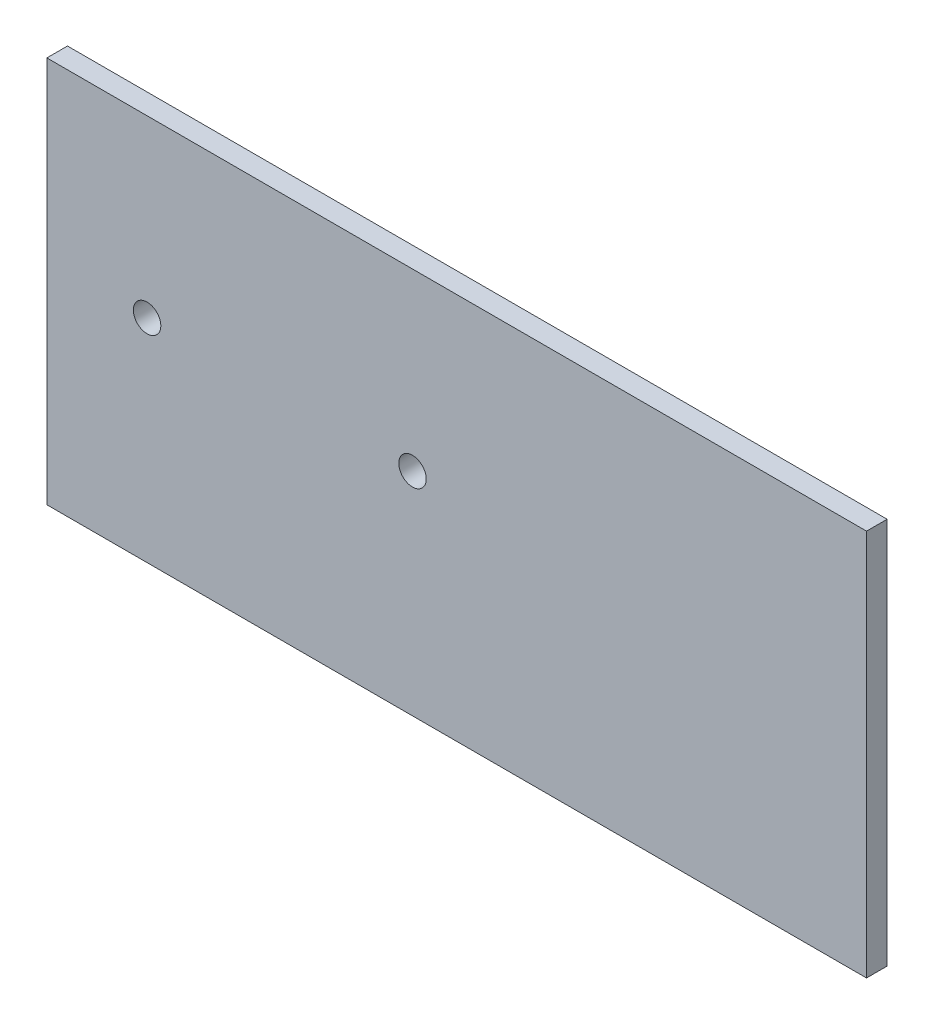
ISO-10303-21;
HEADER;
FILE_DESCRIPTION(('STEP AP214'),'2;1');
FILE_NAME('part.step','',(''),(''),'','','');
FILE_SCHEMA(('AUTOMOTIVE_DESIGN { 1 0 10303 214 1 1 1 1 }'));
ENDSEC;
DATA;
#1=APPLICATION_CONTEXT('core data for automotive mechanical design processes');
#2=APPLICATION_PROTOCOL_DEFINITION('international standard','automotive_design',2000,#1);
#3=PRODUCT_CONTEXT('',#1,'mechanical');
#4=PRODUCT('Part','Part','',(#3));
#5=PRODUCT_RELATED_PRODUCT_CATEGORY('part','',(#4));
#6=PRODUCT_DEFINITION_FORMATION('','',#4);
#7=PRODUCT_DEFINITION_CONTEXT('part definition',#1,'design');
#8=PRODUCT_DEFINITION('design','',#6,#7);
#9=PRODUCT_DEFINITION_SHAPE('','',#8);
#10=(LENGTH_UNIT() NAMED_UNIT(*) SI_UNIT(.MILLI.,.METRE.));
#11=(NAMED_UNIT(*) PLANE_ANGLE_UNIT() SI_UNIT($,.RADIAN.));
#12=(NAMED_UNIT(*) SI_UNIT($,.STERADIAN.) SOLID_ANGLE_UNIT());
#13=UNCERTAINTY_MEASURE_WITH_UNIT(LENGTH_MEASURE(1.E-05),#10,'distance_accuracy_value','');
#14=(GEOMETRIC_REPRESENTATION_CONTEXT(3) GLOBAL_UNCERTAINTY_ASSIGNED_CONTEXT((#13)) GLOBAL_UNIT_ASSIGNED_CONTEXT((#10,
#11,#12)) REPRESENTATION_CONTEXT('',''));
#15=CARTESIAN_POINT('',(0.,0.,0.));
#16=DIRECTION('',(0.,0.,1.));
#17=DIRECTION('',(1.,0.,0.));
#18=AXIS2_PLACEMENT_3D('',#15,#16,#17);
#19=CARTESIAN_POINT('',(0.,0.,3.));
#20=DIRECTION('',(0.,0.,1.));
#21=DIRECTION('',(1.,0.,0.));
#22=AXIS2_PLACEMENT_3D('',#19,#20,#21);
#23=PLANE('',#22);
#24=CARTESIAN_POINT('',(-29.1237716692326,0.,3.));
#25=DIRECTION('',(0.,0.,1.));
#26=DIRECTION('',(1.,0.,0.));
#27=AXIS2_PLACEMENT_3D('',#24,#25,#26);
#28=CIRCLE('',#27,2.);
#29=CARTESIAN_POINT('',(-27.1237716692326,0.,3.));
#30=VERTEX_POINT('',#29);
#31=EDGE_CURVE('E129',#30,#30,#28,.T.);
#32=ORIENTED_EDGE('',*,*,#31,.F.);
#33=EDGE_LOOP('',(#32));
#34=FACE_BOUND('',#33,.T.);
#35=DIRECTION('',(0.,-1.,0.));
#36=VECTOR('',#35,1.);
#37=CARTESIAN_POINT('',(-82.3508635107341,25.4889113146295,3.));
#38=LINE('',#37,#36);
#39=CARTESIAN_POINT('',(-82.3508635107341,25.4889113146295,3.));
#40=VERTEX_POINT('',#39);
#41=CARTESIAN_POINT('',(-82.3508635107341,-30.8533450766115,3.));
#42=VERTEX_POINT('',#41);
#43=EDGE_CURVE('E113',#40,#42,#38,.T.);
#44=ORIENTED_EDGE('',*,*,#43,.T.);
#45=DIRECTION('',(1.,0.,0.));
#46=VECTOR('',#45,1.);
#47=CARTESIAN_POINT('',(-82.3508635107341,-30.8533450766115,3.));
#48=LINE('',#47,#46);
#49=CARTESIAN_POINT('',(36.9766227327241,-30.8533450766115,3.));
#50=VERTEX_POINT('',#49);
#51=EDGE_CURVE('E105',#42,#50,#48,.T.);
#52=ORIENTED_EDGE('',*,*,#51,.T.);
#53=DIRECTION('',(0.,-1.,0.));
#54=VECTOR('',#53,1.);
#55=CARTESIAN_POINT('',(36.9766227327241,25.4889113146295,3.));
#56=LINE('',#55,#54);
#57=CARTESIAN_POINT('',(36.9766227327241,25.4889113146295,3.));
#58=VERTEX_POINT('',#57);
#59=EDGE_CURVE('E112',#58,#50,#56,.T.);
#60=ORIENTED_EDGE('',*,*,#59,.F.);
#61=DIRECTION('',(1.,0.,0.));
#62=VECTOR('',#61,1.);
#63=CARTESIAN_POINT('',(-82.3508635107341,25.4889113146295,3.));
#64=LINE('',#63,#62);
#65=EDGE_CURVE('E122',#40,#58,#64,.T.);
#66=ORIENTED_EDGE('',*,*,#65,.F.);
#67=EDGE_LOOP('',(#44,#52,#60,#66));
#68=FACE_BOUND('',#67,.T.);
#69=CARTESIAN_POINT('',(-67.7615716692326,0.,3.));
#70=DIRECTION('',(0.,0.,1.));
#71=DIRECTION('',(1.,0.,0.));
#72=AXIS2_PLACEMENT_3D('',#69,#70,#71);
#73=CIRCLE('',#72,2.);
#74=CARTESIAN_POINT('',(-65.7615716692326,0.,3.));
#75=VERTEX_POINT('',#74);
#76=EDGE_CURVE('E142',#75,#75,#73,.T.);
#77=ORIENTED_EDGE('',*,*,#76,.F.);
#78=EDGE_LOOP('',(#77));
#79=FACE_BOUND('',#78,.T.);
#80=ADVANCED_FACE('F63',(#34,#68,#79),#23,.T.);
#81=CARTESIAN_POINT('',(0.,0.,0.));
#82=DIRECTION('',(0.,0.,1.));
#83=DIRECTION('',(1.,0.,0.));
#84=AXIS2_PLACEMENT_3D('',#81,#82,#83);
#85=PLANE('',#84);
#86=CARTESIAN_POINT('',(-29.1237716692326,0.,0.));
#87=DIRECTION('',(0.,0.,1.));
#88=DIRECTION('',(1.,0.,0.));
#89=AXIS2_PLACEMENT_3D('',#86,#87,#88);
#90=CIRCLE('',#89,2.);
#91=CARTESIAN_POINT('',(-27.1237716692326,0.,0.));
#92=VERTEX_POINT('',#91);
#93=EDGE_CURVE('E139',#92,#92,#90,.T.);
#94=ORIENTED_EDGE('',*,*,#93,.T.);
#95=EDGE_LOOP('',(#94));
#96=FACE_BOUND('',#95,.T.);
#97=DIRECTION('',(0.,-1.,0.));
#98=VECTOR('',#97,1.);
#99=CARTESIAN_POINT('',(-82.3508635107341,25.4889113146295,0.));
#100=LINE('',#99,#98);
#101=CARTESIAN_POINT('',(-82.3508635107341,25.4889113146295,0.));
#102=VERTEX_POINT('',#101);
#103=CARTESIAN_POINT('',(-82.3508635107341,-30.8533450766115,0.));
#104=VERTEX_POINT('',#103);
#105=EDGE_CURVE('E127',#102,#104,#100,.T.);
#106=ORIENTED_EDGE('',*,*,#105,.F.);
#107=DIRECTION('',(1.,0.,0.));
#108=VECTOR('',#107,1.);
#109=CARTESIAN_POINT('',(-82.3508635107341,25.4889113146295,0.));
#110=LINE('',#109,#108);
#111=CARTESIAN_POINT('',(36.9766227327241,25.4889113146295,0.));
#112=VERTEX_POINT('',#111);
#113=EDGE_CURVE('E133',#102,#112,#110,.T.);
#114=ORIENTED_EDGE('',*,*,#113,.T.);
#115=DIRECTION('',(0.,-1.,0.));
#116=VECTOR('',#115,1.);
#117=CARTESIAN_POINT('',(36.9766227327241,25.4889113146295,0.));
#118=LINE('',#117,#116);
#119=CARTESIAN_POINT('',(36.9766227327241,-30.8533450766115,0.));
#120=VERTEX_POINT('',#119);
#121=EDGE_CURVE('E131',#112,#120,#118,.T.);
#122=ORIENTED_EDGE('',*,*,#121,.T.);
#123=DIRECTION('',(1.,0.,0.));
#124=VECTOR('',#123,1.);
#125=CARTESIAN_POINT('',(-82.3508635107341,-30.8533450766115,0.));
#126=LINE('',#125,#124);
#127=EDGE_CURVE('E118',#104,#120,#126,.T.);
#128=ORIENTED_EDGE('',*,*,#127,.F.);
#129=EDGE_LOOP('',(#106,#114,#122,#128));
#130=FACE_BOUND('',#129,.T.);
#131=CARTESIAN_POINT('',(-67.7615716692326,0.,0.));
#132=DIRECTION('',(0.,0.,1.));
#133=DIRECTION('',(1.,0.,0.));
#134=AXIS2_PLACEMENT_3D('',#131,#132,#133);
#135=CIRCLE('',#134,2.);
#136=CARTESIAN_POINT('',(-65.7615716692326,0.,0.));
#137=VERTEX_POINT('',#136);
#138=EDGE_CURVE('E145',#137,#137,#135,.T.);
#139=ORIENTED_EDGE('',*,*,#138,.T.);
#140=EDGE_LOOP('',(#139));
#141=FACE_BOUND('',#140,.T.);
#142=ADVANCED_FACE('F154',(#96,#130,#141),#85,.F.);
#143=CARTESIAN_POINT('',(-82.3508635107341,25.4889113146295,3.));
#144=DIRECTION('',(1.,0.,0.));
#145=DIRECTION('',(0.,0.,-1.));
#146=AXIS2_PLACEMENT_3D('',#143,#144,#145);
#147=PLANE('',#146);
#148=ORIENTED_EDGE('',*,*,#105,.T.);
#149=DIRECTION('',(0.,0.,-1.));
#150=VECTOR('',#149,1.);
#151=CARTESIAN_POINT('',(-82.3508635107341,-30.8533450766115,3.));
#152=LINE('',#151,#150);
#153=EDGE_CURVE('E12',#42,#104,#152,.T.);
#154=ORIENTED_EDGE('',*,*,#153,.F.);
#155=ORIENTED_EDGE('',*,*,#43,.F.);
#156=DIRECTION('',(0.,0.,-1.));
#157=VECTOR('',#156,1.);
#158=CARTESIAN_POINT('',(-82.3508635107341,25.4889113146295,3.));
#159=LINE('',#158,#157);
#160=EDGE_CURVE('E80',#40,#102,#159,.T.);
#161=ORIENTED_EDGE('',*,*,#160,.T.);
#162=EDGE_LOOP('',(#148,#154,#155,#161));
#163=FACE_BOUND('',#162,.T.);
#164=ADVANCED_FACE('F65',(#163),#147,.F.);
#165=CARTESIAN_POINT('',(-82.3508635107341,-30.8533450766115,3.));
#166=DIRECTION('',(0.,1.,0.));
#167=DIRECTION('',(0.,0.,1.));
#168=AXIS2_PLACEMENT_3D('',#165,#166,#167);
#169=PLANE('',#168);
#170=ORIENTED_EDGE('',*,*,#127,.T.);
#171=DIRECTION('',(0.,0.,-1.));
#172=VECTOR('',#171,1.);
#173=CARTESIAN_POINT('',(36.9766227327241,-30.8533450766115,3.));
#174=LINE('',#173,#172);
#175=EDGE_CURVE('E72',#50,#120,#174,.T.);
#176=ORIENTED_EDGE('',*,*,#175,.F.);
#177=ORIENTED_EDGE('',*,*,#51,.F.);
#178=ORIENTED_EDGE('',*,*,#153,.T.);
#179=EDGE_LOOP('',(#170,#176,#177,#178));
#180=FACE_BOUND('',#179,.T.);
#181=ADVANCED_FACE('F117',(#180),#169,.F.);
#182=CARTESIAN_POINT('',(36.9766227327241,25.4889113146295,3.));
#183=DIRECTION('',(1.,0.,0.));
#184=DIRECTION('',(0.,0.,-1.));
#185=AXIS2_PLACEMENT_3D('',#182,#183,#184);
#186=PLANE('',#185);
#187=ORIENTED_EDGE('',*,*,#121,.F.);
#188=DIRECTION('',(0.,0.,-1.));
#189=VECTOR('',#188,1.);
#190=CARTESIAN_POINT('',(36.9766227327241,25.4889113146295,3.));
#191=LINE('',#190,#189);
#192=EDGE_CURVE('E94',#58,#112,#191,.T.);
#193=ORIENTED_EDGE('',*,*,#192,.F.);
#194=ORIENTED_EDGE('',*,*,#59,.T.);
#195=ORIENTED_EDGE('',*,*,#175,.T.);
#196=EDGE_LOOP('',(#187,#193,#194,#195));
#197=FACE_BOUND('',#196,.T.);
#198=ADVANCED_FACE('F121',(#197),#186,.T.);
#199=CARTESIAN_POINT('',(-82.3508635107341,25.4889113146295,3.));
#200=DIRECTION('',(0.,1.,0.));
#201=DIRECTION('',(0.,0.,1.));
#202=AXIS2_PLACEMENT_3D('',#199,#200,#201);
#203=PLANE('',#202);
#204=ORIENTED_EDGE('',*,*,#113,.F.);
#205=ORIENTED_EDGE('',*,*,#160,.F.);
#206=ORIENTED_EDGE('',*,*,#65,.T.);
#207=ORIENTED_EDGE('',*,*,#192,.T.);
#208=EDGE_LOOP('',(#204,#205,#206,#207));
#209=FACE_BOUND('',#208,.T.);
#210=ADVANCED_FACE('F167',(#209),#203,.T.);
#211=CARTESIAN_POINT('',(-29.1237716692326,0.,3.));
#212=DIRECTION('',(0.,0.,-1.));
#213=DIRECTION('',(-1.,0.,0.));
#214=AXIS2_PLACEMENT_3D('',#211,#212,#213);
#215=CYLINDRICAL_SURFACE('',#214,2.);
#216=ORIENTED_EDGE('',*,*,#31,.T.);
#217=EDGE_LOOP('',(#216));
#218=FACE_BOUND('',#217,.T.);
#219=ORIENTED_EDGE('',*,*,#93,.F.);
#220=EDGE_LOOP('',(#219));
#221=FACE_BOUND('',#220,.T.);
#222=ADVANCED_FACE('F164',(#218,#221),#215,.F.);
#223=CARTESIAN_POINT('',(-67.7615716692326,0.,3.));
#224=DIRECTION('',(0.,0.,-1.));
#225=DIRECTION('',(-1.,0.,0.));
#226=AXIS2_PLACEMENT_3D('',#223,#224,#225);
#227=CYLINDRICAL_SURFACE('',#226,2.);
#228=ORIENTED_EDGE('',*,*,#76,.T.);
#229=EDGE_LOOP('',(#228));
#230=FACE_BOUND('',#229,.T.);
#231=ORIENTED_EDGE('',*,*,#138,.F.);
#232=EDGE_LOOP('',(#231));
#233=FACE_BOUND('',#232,.T.);
#234=ADVANCED_FACE('F151',(#230,#233),#227,.F.);
#235=CLOSED_SHELL('',(#80,#142,#164,#181,#198,#210,#222,#234));
#236=MANIFOLD_SOLID_BREP('B2',#235);
#237=ADVANCED_BREP_SHAPE_REPRESENTATION('',(#18,#236),#14);
#238=SHAPE_DEFINITION_REPRESENTATION(#9,#237);
ENDSEC;
END-ISO-10303-21;
